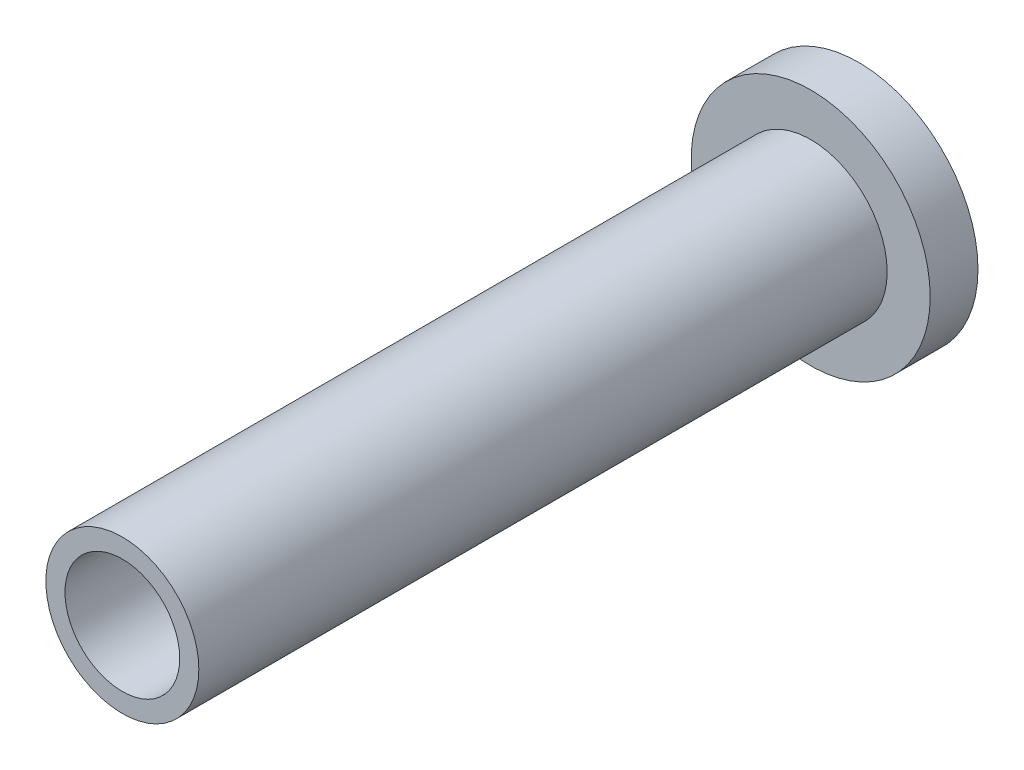
ISO-10303-21;
HEADER;
FILE_DESCRIPTION(('STEP AP214'),'2;1');
FILE_NAME('part.step','',(''),(''),'','','');
FILE_SCHEMA(('AUTOMOTIVE_DESIGN { 1 0 10303 214 1 1 1 1 }'));
ENDSEC;
DATA;
#1=APPLICATION_CONTEXT('core data for automotive mechanical design processes');
#2=APPLICATION_PROTOCOL_DEFINITION('international standard','automotive_design',2000,#1);
#3=PRODUCT_CONTEXT('',#1,'mechanical');
#4=PRODUCT('Part','Part','',(#3));
#5=PRODUCT_RELATED_PRODUCT_CATEGORY('part','',(#4));
#6=PRODUCT_DEFINITION_FORMATION('','',#4);
#7=PRODUCT_DEFINITION_CONTEXT('part definition',#1,'design');
#8=PRODUCT_DEFINITION('design','',#6,#7);
#9=PRODUCT_DEFINITION_SHAPE('','',#8);
#10=(LENGTH_UNIT() NAMED_UNIT(*) SI_UNIT(.MILLI.,.METRE.));
#11=(NAMED_UNIT(*) PLANE_ANGLE_UNIT() SI_UNIT($,.RADIAN.));
#12=(NAMED_UNIT(*) SI_UNIT($,.STERADIAN.) SOLID_ANGLE_UNIT());
#13=UNCERTAINTY_MEASURE_WITH_UNIT(LENGTH_MEASURE(1.E-05),#10,'distance_accuracy_value','');
#14=(GEOMETRIC_REPRESENTATION_CONTEXT(3) GLOBAL_UNCERTAINTY_ASSIGNED_CONTEXT((#13)) GLOBAL_UNIT_ASSIGNED_CONTEXT((#10,
#11,#12)) REPRESENTATION_CONTEXT('',''));
#15=CARTESIAN_POINT('',(0.,0.,0.));
#16=DIRECTION('',(0.,0.,1.));
#17=DIRECTION('',(1.,0.,0.));
#18=AXIS2_PLACEMENT_3D('',#15,#16,#17);
#19=CARTESIAN_POINT('',(0.,0.,15.));
#20=DIRECTION('',(0.,0.,1.));
#21=DIRECTION('',(1.,0.,0.));
#22=AXIS2_PLACEMENT_3D('',#19,#20,#21);
#23=CYLINDRICAL_SURFACE('',#22,5.25);
#24=CARTESIAN_POINT('',(0.,0.,15.));
#25=DIRECTION('',(0.,0.,1.));
#26=DIRECTION('',(1.,0.,0.));
#27=AXIS2_PLACEMENT_3D('',#24,#25,#26);
#28=CIRCLE('',#27,5.25);
#29=CARTESIAN_POINT('',(5.25,0.,15.));
#30=VERTEX_POINT('',#29);
#31=EDGE_CURVE('E52',#30,#30,#28,.T.);
#32=ORIENTED_EDGE('',*,*,#31,.F.);
#33=EDGE_LOOP('',(#32));
#34=FACE_BOUND('',#33,.T.);
#35=CARTESIAN_POINT('',(0.,0.,66.));
#36=DIRECTION('',(0.,0.,1.));
#37=DIRECTION('',(1.,0.,0.));
#38=AXIS2_PLACEMENT_3D('',#35,#36,#37);
#39=CIRCLE('',#38,5.25);
#40=CARTESIAN_POINT('',(5.25,0.,66.));
#41=VERTEX_POINT('',#40);
#42=EDGE_CURVE('E49',#41,#41,#39,.F.);
#43=ORIENTED_EDGE('',*,*,#42,.F.);
#44=EDGE_LOOP('',(#43));
#45=FACE_BOUND('',#44,.T.);
#46=ADVANCED_FACE('F31',(#34,#45),#23,.F.);
#47=CARTESIAN_POINT('',(0.,0.,0.));
#48=DIRECTION('',(0.,0.,1.));
#49=DIRECTION('',(1.,0.,0.));
#50=AXIS2_PLACEMENT_3D('',#47,#48,#49);
#51=CYLINDRICAL_SURFACE('',#50,3.);
#52=CARTESIAN_POINT('',(0.,0.,13.7298294077828));
#53=DIRECTION('',(0.,0.,1.));
#54=DIRECTION('',(1.,0.,0.));
#55=AXIS2_PLACEMENT_3D('',#52,#53,#54);
#56=CIRCLE('',#55,3.);
#57=CARTESIAN_POINT('',(3.,0.,13.7298294077828));
#58=VERTEX_POINT('',#57);
#59=EDGE_CURVE('E10',#58,#58,#56,.T.);
#60=ORIENTED_EDGE('',*,*,#59,.T.);
#61=EDGE_LOOP('',(#60));
#62=FACE_BOUND('',#61,.T.);
#63=CARTESIAN_POINT('',(0.,0.,0.));
#64=DIRECTION('',(0.,0.,1.));
#65=DIRECTION('',(1.,0.,0.));
#66=AXIS2_PLACEMENT_3D('',#63,#64,#65);
#67=CIRCLE('',#66,3.);
#68=CARTESIAN_POINT('',(3.,0.,0.));
#69=VERTEX_POINT('',#68);
#70=EDGE_CURVE('E61',#69,#69,#67,.T.);
#71=ORIENTED_EDGE('',*,*,#70,.F.);
#72=EDGE_LOOP('',(#71));
#73=FACE_BOUND('',#72,.T.);
#74=ADVANCED_FACE('F92',(#62,#73),#51,.F.);
#75=CARTESIAN_POINT('',(0.,0.,5.));
#76=DIRECTION('',(0.,0.,-1.));
#77=DIRECTION('',(-1.,0.,0.));
#78=AXIS2_PLACEMENT_3D('',#75,#76,#77);
#79=CYLINDRICAL_SURFACE('',#78,12.5);
#80=CARTESIAN_POINT('',(0.,0.,5.));
#81=DIRECTION('',(0.,0.,1.));
#82=DIRECTION('',(1.,0.,0.));
#83=AXIS2_PLACEMENT_3D('',#80,#81,#82);
#84=CIRCLE('',#83,12.5);
#85=CARTESIAN_POINT('',(12.5,0.,5.));
#86=VERTEX_POINT('',#85);
#87=EDGE_CURVE('E46',#86,#86,#84,.T.);
#88=ORIENTED_EDGE('',*,*,#87,.F.);
#89=EDGE_LOOP('',(#88));
#90=FACE_BOUND('',#89,.T.);
#91=CARTESIAN_POINT('',(0.,0.,0.));
#92=DIRECTION('',(0.,0.,1.));
#93=DIRECTION('',(1.,0.,0.));
#94=AXIS2_PLACEMENT_3D('',#91,#92,#93);
#95=CIRCLE('',#94,12.5);
#96=CARTESIAN_POINT('',(12.5,0.,0.));
#97=VERTEX_POINT('',#96);
#98=EDGE_CURVE('E56',#97,#97,#95,.T.);
#99=ORIENTED_EDGE('',*,*,#98,.T.);
#100=EDGE_LOOP('',(#99));
#101=FACE_BOUND('',#100,.T.);
#102=ADVANCED_FACE('F33',(#90,#101),#79,.T.);
#103=CARTESIAN_POINT('',(0.,0.,5.));
#104=DIRECTION('',(0.,0.,1.));
#105=DIRECTION('',(1.,0.,0.));
#106=AXIS2_PLACEMENT_3D('',#103,#104,#105);
#107=PLANE('',#106);
#108=CARTESIAN_POINT('',(0.,0.,5.));
#109=DIRECTION('',(0.,0.,1.));
#110=DIRECTION('',(1.,0.,0.));
#111=AXIS2_PLACEMENT_3D('',#108,#109,#110);
#112=CIRCLE('',#111,8.);
#113=CARTESIAN_POINT('',(8.,0.,5.));
#114=VERTEX_POINT('',#113);
#115=EDGE_CURVE('E42',#114,#114,#112,.T.);
#116=ORIENTED_EDGE('',*,*,#115,.F.);
#117=EDGE_LOOP('',(#116));
#118=FACE_BOUND('',#117,.T.);
#119=ORIENTED_EDGE('',*,*,#87,.T.);
#120=EDGE_LOOP('',(#119));
#121=FACE_BOUND('',#120,.T.);
#122=ADVANCED_FACE('F89',(#118,#121),#107,.T.);
#123=CARTESIAN_POINT('',(0.,0.,0.));
#124=DIRECTION('',(0.,0.,1.));
#125=DIRECTION('',(1.,0.,0.));
#126=AXIS2_PLACEMENT_3D('',#123,#124,#125);
#127=PLANE('',#126);
#128=ORIENTED_EDGE('',*,*,#70,.T.);
#129=EDGE_LOOP('',(#128));
#130=FACE_BOUND('',#129,.T.);
#131=ORIENTED_EDGE('',*,*,#98,.F.);
#132=EDGE_LOOP('',(#131));
#133=FACE_BOUND('',#132,.T.);
#134=ADVANCED_FACE('F81',(#130,#133),#127,.F.);
#135=CARTESIAN_POINT('',(0.,0.,77.));
#136=DIRECTION('',(0.,0.,-1.));
#137=DIRECTION('',(-1.,0.,0.));
#138=AXIS2_PLACEMENT_3D('',#135,#136,#137);
#139=CYLINDRICAL_SURFACE('',#138,8.);
#140=CARTESIAN_POINT('',(0.,0.,77.));
#141=DIRECTION('',(0.,0.,1.));
#142=DIRECTION('',(1.,0.,0.));
#143=AXIS2_PLACEMENT_3D('',#140,#141,#142);
#144=CIRCLE('',#143,8.);
#145=CARTESIAN_POINT('',(8.,0.,77.));
#146=VERTEX_POINT('',#145);
#147=EDGE_CURVE('E59',#146,#146,#144,.T.);
#148=ORIENTED_EDGE('',*,*,#147,.F.);
#149=EDGE_LOOP('',(#148));
#150=FACE_BOUND('',#149,.T.);
#151=ORIENTED_EDGE('',*,*,#115,.T.);
#152=EDGE_LOOP('',(#151));
#153=FACE_BOUND('',#152,.T.);
#154=ADVANCED_FACE('F79',(#150,#153),#139,.T.);
#155=CARTESIAN_POINT('',(0.,0.,77.));
#156=DIRECTION('',(0.,0.,1.));
#157=DIRECTION('',(1.,0.,0.));
#158=AXIS2_PLACEMENT_3D('',#155,#156,#157);
#159=PLANE('',#158);
#160=CARTESIAN_POINT('',(0.,0.,77.));
#161=DIRECTION('',(0.,0.,1.));
#162=DIRECTION('',(1.,0.,0.));
#163=AXIS2_PLACEMENT_3D('',#160,#161,#162);
#164=CIRCLE('',#163,6.);
#165=CARTESIAN_POINT('',(6.,0.,77.));
#166=VERTEX_POINT('',#165);
#167=EDGE_CURVE('E69',#166,#166,#164,.T.);
#168=ORIENTED_EDGE('',*,*,#167,.F.);
#169=EDGE_LOOP('',(#168));
#170=FACE_BOUND('',#169,.T.);
#171=ORIENTED_EDGE('',*,*,#147,.T.);
#172=EDGE_LOOP('',(#171));
#173=FACE_BOUND('',#172,.T.);
#174=ADVANCED_FACE('F75',(#170,#173),#159,.T.);
#175=CARTESIAN_POINT('',(0.,0.,15.));
#176=DIRECTION('',(0.,0.,1.));
#177=DIRECTION('',(1.,0.,0.));
#178=AXIS2_PLACEMENT_3D('',#175,#176,#177);
#179=PLANE('',#178);
#180=CARTESIAN_POINT('',(0.,0.,15.));
#181=DIRECTION('',(0.,0.,1.));
#182=DIRECTION('',(1.,0.,0.));
#183=AXIS2_PLACEMENT_3D('',#180,#181,#182);
#184=CIRCLE('',#183,5.20000000000001);
#185=CARTESIAN_POINT('',(5.20000000000001,0.,15.));
#186=VERTEX_POINT('',#185);
#187=EDGE_CURVE('E38',#186,#186,#184,.F.);
#188=ORIENTED_EDGE('',*,*,#187,.T.);
#189=EDGE_LOOP('',(#188));
#190=FACE_BOUND('',#189,.T.);
#191=ORIENTED_EDGE('',*,*,#31,.T.);
#192=EDGE_LOOP('',(#191));
#193=FACE_BOUND('',#192,.T.);
#194=ADVANCED_FACE('F78',(#190,#193),#179,.T.);
#195=CARTESIAN_POINT('',(0.,0.,66.));
#196=DIRECTION('',(0.,0.,1.));
#197=DIRECTION('',(1.,0.,0.));
#198=AXIS2_PLACEMENT_3D('',#195,#196,#197);
#199=PLANE('',#198);
#200=CARTESIAN_POINT('',(0.,0.,66.));
#201=DIRECTION('',(0.,0.,1.));
#202=DIRECTION('',(1.,0.,0.));
#203=AXIS2_PLACEMENT_3D('',#200,#201,#202);
#204=CIRCLE('',#203,6.);
#205=CARTESIAN_POINT('',(6.,0.,66.));
#206=VERTEX_POINT('',#205);
#207=EDGE_CURVE('E53',#206,#206,#204,.T.);
#208=ORIENTED_EDGE('',*,*,#207,.T.);
#209=EDGE_LOOP('',(#208));
#210=FACE_BOUND('',#209,.T.);
#211=ORIENTED_EDGE('',*,*,#42,.T.);
#212=EDGE_LOOP('',(#211));
#213=FACE_BOUND('',#212,.T.);
#214=ADVANCED_FACE('F116',(#210,#213),#199,.T.);
#215=CARTESIAN_POINT('',(0.,0.,66.));
#216=DIRECTION('',(0.,0.,1.));
#217=DIRECTION('',(1.,0.,0.));
#218=AXIS2_PLACEMENT_3D('',#215,#216,#217);
#219=CYLINDRICAL_SURFACE('',#218,6.);
#220=ORIENTED_EDGE('',*,*,#207,.F.);
#221=EDGE_LOOP('',(#220));
#222=FACE_BOUND('',#221,.T.);
#223=ORIENTED_EDGE('',*,*,#167,.T.);
#224=EDGE_LOOP('',(#223));
#225=FACE_BOUND('',#224,.T.);
#226=ADVANCED_FACE('F73',(#222,#225),#219,.F.);
#227=CARTESIAN_POINT('',(0.,0.,15.));
#228=DIRECTION('',(0.,0.,1.));
#229=DIRECTION('',(1.,0.,0.));
#230=AXIS2_PLACEMENT_3D('',#227,#228,#229);
#231=CONICAL_SURFACE('',#230,5.20000000000001,1.04719755119659);
#232=ORIENTED_EDGE('',*,*,#59,.F.);
#233=EDGE_LOOP('',(#232));
#234=FACE_BOUND('',#233,.T.);
#235=ORIENTED_EDGE('',*,*,#187,.F.);
#236=EDGE_LOOP('',(#235));
#237=FACE_BOUND('',#236,.T.);
#238=ADVANCED_FACE('F119',(#234,#237),#231,.F.);
#239=CLOSED_SHELL('',(#46,#74,#102,#122,#134,#154,#174,#194,#214,#226,#238));
#240=MANIFOLD_SOLID_BREP('B2',#239);
#241=ADVANCED_BREP_SHAPE_REPRESENTATION('',(#18,#240),#14);
#242=SHAPE_DEFINITION_REPRESENTATION(#9,#241);
ENDSEC;
END-ISO-10303-21;
